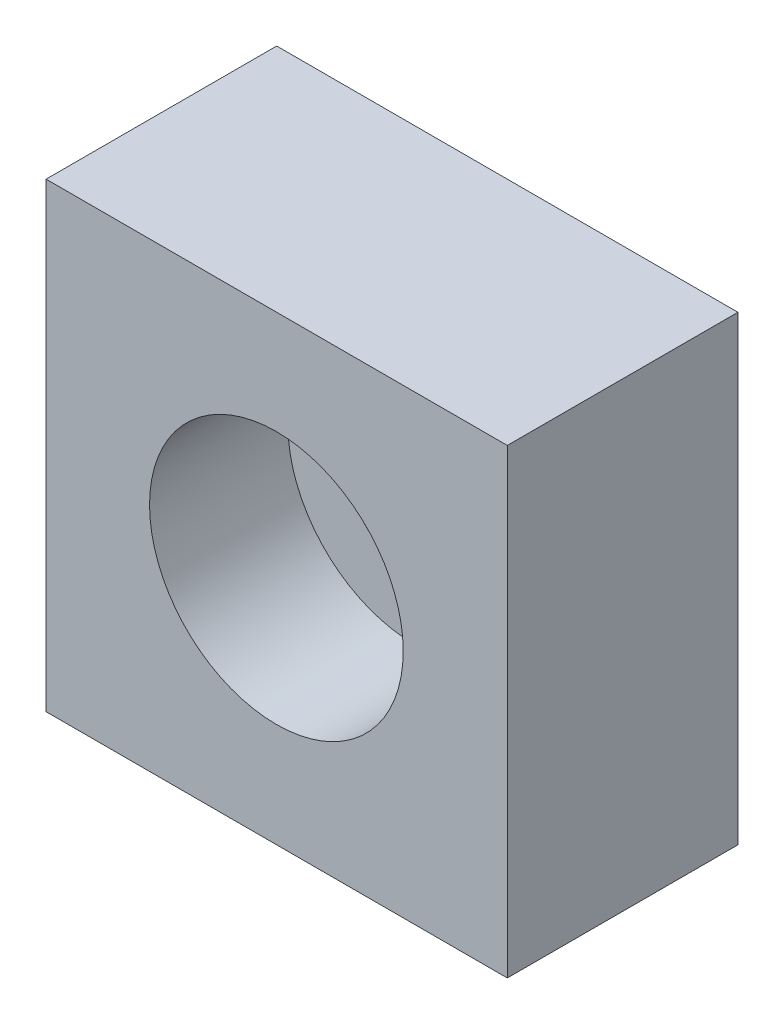
ISO-10303-21;
HEADER;
FILE_DESCRIPTION(('STEP AP214'),'2;1');
FILE_NAME('part.step','',(''),(''),'','','');
FILE_SCHEMA(('AUTOMOTIVE_DESIGN { 1 0 10303 214 1 1 1 1 }'));
ENDSEC;
DATA;
#1=APPLICATION_CONTEXT('core data for automotive mechanical design processes');
#2=APPLICATION_PROTOCOL_DEFINITION('international standard','automotive_design',2000,#1);
#3=PRODUCT_CONTEXT('',#1,'mechanical');
#4=PRODUCT('Part','Part','',(#3));
#5=PRODUCT_RELATED_PRODUCT_CATEGORY('part','',(#4));
#6=PRODUCT_DEFINITION_FORMATION('','',#4);
#7=PRODUCT_DEFINITION_CONTEXT('part definition',#1,'design');
#8=PRODUCT_DEFINITION('design','',#6,#7);
#9=PRODUCT_DEFINITION_SHAPE('','',#8);
#10=(LENGTH_UNIT() NAMED_UNIT(*) SI_UNIT(.MILLI.,.METRE.));
#11=(NAMED_UNIT(*) PLANE_ANGLE_UNIT() SI_UNIT($,.RADIAN.));
#12=(NAMED_UNIT(*) SI_UNIT($,.STERADIAN.) SOLID_ANGLE_UNIT());
#13=UNCERTAINTY_MEASURE_WITH_UNIT(LENGTH_MEASURE(1.E-05),#10,'distance_accuracy_value','');
#14=(GEOMETRIC_REPRESENTATION_CONTEXT(3) GLOBAL_UNCERTAINTY_ASSIGNED_CONTEXT((#13)) GLOBAL_UNIT_ASSIGNED_CONTEXT((#10,
#11,#12)) REPRESENTATION_CONTEXT('',''));
#15=CARTESIAN_POINT('',(0.,0.,0.));
#16=DIRECTION('',(0.,0.,1.));
#17=DIRECTION('',(1.,0.,0.));
#18=AXIS2_PLACEMENT_3D('',#15,#16,#17);
#19=CARTESIAN_POINT('',(0.,0.,10.));
#20=DIRECTION('',(1.,0.,0.));
#21=DIRECTION('',(0.,0.,-1.));
#22=AXIS2_PLACEMENT_3D('',#19,#20,#21);
#23=PLANE('',#22);
#24=DIRECTION('',(0.,-1.,0.));
#25=VECTOR('',#24,1.);
#26=CARTESIAN_POINT('',(0.,0.,0.));
#27=LINE('',#26,#25);
#28=CARTESIAN_POINT('',(0.,20.,0.));
#29=VERTEX_POINT('',#28);
#30=CARTESIAN_POINT('',(0.,0.,0.));
#31=VERTEX_POINT('',#30);
#32=EDGE_CURVE('E105',#29,#31,#27,.T.);
#33=ORIENTED_EDGE('',*,*,#32,.T.);
#34=DIRECTION('',(0.,0.,-1.));
#35=VECTOR('',#34,1.);
#36=CARTESIAN_POINT('',(0.,0.,10.));
#37=LINE('',#36,#35);
#38=CARTESIAN_POINT('',(0.,0.,10.));
#39=VERTEX_POINT('',#38);
#40=EDGE_CURVE('E11',#39,#31,#37,.T.);
#41=ORIENTED_EDGE('',*,*,#40,.F.);
#42=DIRECTION('',(0.,-1.,0.));
#43=VECTOR('',#42,1.);
#44=CARTESIAN_POINT('',(0.,0.,10.));
#45=LINE('',#44,#43);
#46=CARTESIAN_POINT('',(0.,20.,10.));
#47=VERTEX_POINT('',#46);
#48=EDGE_CURVE('E89',#47,#39,#45,.T.);
#49=ORIENTED_EDGE('',*,*,#48,.F.);
#50=DIRECTION('',(0.,0.,-1.));
#51=VECTOR('',#50,1.);
#52=CARTESIAN_POINT('',(0.,20.,10.));
#53=LINE('',#52,#51);
#54=EDGE_CURVE('E98',#47,#29,#53,.T.);
#55=ORIENTED_EDGE('',*,*,#54,.T.);
#56=EDGE_LOOP('',(#33,#41,#49,#55));
#57=FACE_BOUND('',#56,.T.);
#58=ADVANCED_FACE('F39',(#57),#23,.F.);
#59=CARTESIAN_POINT('',(0.,0.,10.));
#60=DIRECTION('',(0.,1.,0.));
#61=DIRECTION('',(0.,0.,1.));
#62=AXIS2_PLACEMENT_3D('',#59,#60,#61);
#63=PLANE('',#62);
#64=DIRECTION('',(1.,0.,0.));
#65=VECTOR('',#64,1.);
#66=CARTESIAN_POINT('',(0.,0.,0.));
#67=LINE('',#66,#65);
#68=CARTESIAN_POINT('',(20.,0.,0.));
#69=VERTEX_POINT('',#68);
#70=EDGE_CURVE('E94',#31,#69,#67,.T.);
#71=ORIENTED_EDGE('',*,*,#70,.T.);
#72=DIRECTION('',(0.,0.,-1.));
#73=VECTOR('',#72,1.);
#74=CARTESIAN_POINT('',(20.,0.,10.));
#75=LINE('',#74,#73);
#76=CARTESIAN_POINT('',(20.,0.,10.));
#77=VERTEX_POINT('',#76);
#78=EDGE_CURVE('E50',#77,#69,#75,.T.);
#79=ORIENTED_EDGE('',*,*,#78,.F.);
#80=DIRECTION('',(1.,0.,0.));
#81=VECTOR('',#80,1.);
#82=CARTESIAN_POINT('',(0.,0.,10.));
#83=LINE('',#82,#81);
#84=EDGE_CURVE('E85',#39,#77,#83,.T.);
#85=ORIENTED_EDGE('',*,*,#84,.F.);
#86=ORIENTED_EDGE('',*,*,#40,.T.);
#87=EDGE_LOOP('',(#71,#79,#85,#86));
#88=FACE_BOUND('',#87,.T.);
#89=ADVANCED_FACE('F91',(#88),#63,.F.);
#90=CARTESIAN_POINT('',(20.,0.,10.));
#91=DIRECTION('',(-1.,0.,0.));
#92=DIRECTION('',(0.,0.,1.));
#93=AXIS2_PLACEMENT_3D('',#90,#91,#92);
#94=PLANE('',#93);
#95=DIRECTION('',(0.,1.,0.));
#96=VECTOR('',#95,1.);
#97=CARTESIAN_POINT('',(20.,0.,0.));
#98=LINE('',#97,#96);
#99=CARTESIAN_POINT('',(20.,20.,0.));
#100=VERTEX_POINT('',#99);
#101=EDGE_CURVE('E75',#69,#100,#98,.T.);
#102=ORIENTED_EDGE('',*,*,#101,.T.);
#103=DIRECTION('',(0.,0.,-1.));
#104=VECTOR('',#103,1.);
#105=CARTESIAN_POINT('',(20.,20.,10.));
#106=LINE('',#105,#104);
#107=CARTESIAN_POINT('',(20.,20.,10.));
#108=VERTEX_POINT('',#107);
#109=EDGE_CURVE('E92',#108,#100,#106,.T.);
#110=ORIENTED_EDGE('',*,*,#109,.F.);
#111=DIRECTION('',(0.,1.,0.));
#112=VECTOR('',#111,1.);
#113=CARTESIAN_POINT('',(20.,0.,10.));
#114=LINE('',#113,#112);
#115=EDGE_CURVE('E86',#77,#108,#114,.T.);
#116=ORIENTED_EDGE('',*,*,#115,.F.);
#117=ORIENTED_EDGE('',*,*,#78,.T.);
#118=EDGE_LOOP('',(#102,#110,#116,#117));
#119=FACE_BOUND('',#118,.T.);
#120=ADVANCED_FACE('F96',(#119),#94,.F.);
#121=CARTESIAN_POINT('',(0.,20.,10.));
#122=DIRECTION('',(0.,-1.,0.));
#123=DIRECTION('',(0.,0.,-1.));
#124=AXIS2_PLACEMENT_3D('',#121,#122,#123);
#125=PLANE('',#124);
#126=DIRECTION('',(-1.,0.,0.));
#127=VECTOR('',#126,1.);
#128=CARTESIAN_POINT('',(0.,20.,0.));
#129=LINE('',#128,#127);
#130=EDGE_CURVE('E77',#100,#29,#129,.T.);
#131=ORIENTED_EDGE('',*,*,#130,.T.);
#132=ORIENTED_EDGE('',*,*,#54,.F.);
#133=DIRECTION('',(-1.,0.,0.));
#134=VECTOR('',#133,1.);
#135=CARTESIAN_POINT('',(0.,20.,10.));
#136=LINE('',#135,#134);
#137=EDGE_CURVE('E54',#108,#47,#136,.T.);
#138=ORIENTED_EDGE('',*,*,#137,.F.);
#139=ORIENTED_EDGE('',*,*,#109,.T.);
#140=EDGE_LOOP('',(#131,#132,#138,#139));
#141=FACE_BOUND('',#140,.T.);
#142=ADVANCED_FACE('F109',(#141),#125,.F.);
#143=CARTESIAN_POINT('',(0.,0.,10.));
#144=DIRECTION('',(0.,0.,-1.));
#145=DIRECTION('',(-1.,0.,0.));
#146=AXIS2_PLACEMENT_3D('',#143,#144,#145);
#147=PLANE('',#146);
#148=CARTESIAN_POINT('',(9.98648737498797,10.0143055988724,10.));
#149=DIRECTION('',(0.,0.,1.));
#150=DIRECTION('',(1.,0.,0.));
#151=AXIS2_PLACEMENT_3D('',#148,#149,#150);
#152=CIRCLE('',#151,5.49999999999999);
#153=CARTESIAN_POINT('',(15.486487374988,10.0143055988724,10.));
#154=VERTEX_POINT('',#153);
#155=EDGE_CURVE('E123',#154,#154,#152,.T.);
#156=ORIENTED_EDGE('',*,*,#155,.F.);
#157=EDGE_LOOP('',(#156));
#158=FACE_BOUND('',#157,.T.);
#159=ORIENTED_EDGE('',*,*,#48,.T.);
#160=ORIENTED_EDGE('',*,*,#84,.T.);
#161=ORIENTED_EDGE('',*,*,#115,.T.);
#162=ORIENTED_EDGE('',*,*,#137,.T.);
#163=EDGE_LOOP('',(#159,#160,#161,#162));
#164=FACE_BOUND('',#163,.T.);
#165=ADVANCED_FACE('F88',(#158,#164),#147,.F.);
#166=CARTESIAN_POINT('',(0.,0.,0.));
#167=DIRECTION('',(0.,0.,-1.));
#168=DIRECTION('',(-1.,0.,0.));
#169=AXIS2_PLACEMENT_3D('',#166,#167,#168);
#170=PLANE('',#169);
#171=CARTESIAN_POINT('',(9.98648737498797,10.0143055988724,0.));
#172=DIRECTION('',(0.,0.,1.));
#173=DIRECTION('',(1.,0.,0.));
#174=AXIS2_PLACEMENT_3D('',#171,#172,#173);
#175=CIRCLE('',#174,3.00000000000001);
#176=CARTESIAN_POINT('',(12.986487374988,10.0143055988724,0.));
#177=VERTEX_POINT('',#176);
#178=EDGE_CURVE('E104',#177,#177,#175,.T.);
#179=ORIENTED_EDGE('',*,*,#178,.T.);
#180=EDGE_LOOP('',(#179));
#181=FACE_BOUND('',#180,.T.);
#182=ORIENTED_EDGE('',*,*,#32,.F.);
#183=ORIENTED_EDGE('',*,*,#130,.F.);
#184=ORIENTED_EDGE('',*,*,#101,.F.);
#185=ORIENTED_EDGE('',*,*,#70,.F.);
#186=EDGE_LOOP('',(#182,#183,#184,#185));
#187=FACE_BOUND('',#186,.T.);
#188=ADVANCED_FACE('F114',(#181,#187),#170,.T.);
#189=CARTESIAN_POINT('',(9.98648737498797,10.0143055988724,10.));
#190=DIRECTION('',(0.,0.,1.));
#191=DIRECTION('',(1.,0.,0.));
#192=AXIS2_PLACEMENT_3D('',#189,#190,#191);
#193=CYLINDRICAL_SURFACE('',#192,3.00000000000001);
#194=ORIENTED_EDGE('',*,*,#178,.F.);
#195=EDGE_LOOP('',(#194));
#196=FACE_BOUND('',#195,.T.);
#197=CARTESIAN_POINT('',(9.98648737498797,10.0143055988724,4.));
#198=DIRECTION('',(0.,0.,1.));
#199=DIRECTION('',(1.,0.,0.));
#200=AXIS2_PLACEMENT_3D('',#197,#198,#199);
#201=CIRCLE('',#200,3.00000000000001);
#202=CARTESIAN_POINT('',(12.986487374988,10.0143055988724,4.));
#203=VERTEX_POINT('',#202);
#204=EDGE_CURVE('E117',#203,#203,#201,.T.);
#205=ORIENTED_EDGE('',*,*,#204,.T.);
#206=EDGE_LOOP('',(#205));
#207=FACE_BOUND('',#206,.T.);
#208=ADVANCED_FACE('F136',(#196,#207),#193,.F.);
#209=CARTESIAN_POINT('',(12.986487374988,10.0143055988724,4.));
#210=DIRECTION('',(0.,0.,-1.));
#211=DIRECTION('',(-1.,0.,0.));
#212=AXIS2_PLACEMENT_3D('',#209,#210,#211);
#213=PLANE('',#212);
#214=ORIENTED_EDGE('',*,*,#204,.F.);
#215=EDGE_LOOP('',(#214));
#216=FACE_BOUND('',#215,.T.);
#217=CARTESIAN_POINT('',(9.98648737498797,10.0143055988724,4.));
#218=DIRECTION('',(0.,0.,1.));
#219=DIRECTION('',(1.,0.,0.));
#220=AXIS2_PLACEMENT_3D('',#217,#218,#219);
#221=CIRCLE('',#220,5.49999999999999);
#222=CARTESIAN_POINT('',(15.486487374988,10.0143055988724,4.));
#223=VERTEX_POINT('',#222);
#224=EDGE_CURVE('E121',#223,#223,#221,.T.);
#225=ORIENTED_EDGE('',*,*,#224,.T.);
#226=EDGE_LOOP('',(#225));
#227=FACE_BOUND('',#226,.T.);
#228=ADVANCED_FACE('F176',(#216,#227),#213,.F.);
#229=CARTESIAN_POINT('',(9.98648737498797,10.0143055988724,10.));
#230=DIRECTION('',(0.,0.,1.));
#231=DIRECTION('',(1.,0.,0.));
#232=AXIS2_PLACEMENT_3D('',#229,#230,#231);
#233=CYLINDRICAL_SURFACE('',#232,5.49999999999999);
#234=ORIENTED_EDGE('',*,*,#224,.F.);
#235=EDGE_LOOP('',(#234));
#236=FACE_BOUND('',#235,.T.);
#237=ORIENTED_EDGE('',*,*,#155,.T.);
#238=EDGE_LOOP('',(#237));
#239=FACE_BOUND('',#238,.T.);
#240=ADVANCED_FACE('F126',(#236,#239),#233,.F.);
#241=CLOSED_SHELL('',(#58,#89,#120,#142,#165,#188,#208,#228,#240));
#242=MANIFOLD_SOLID_BREP('B2',#241);
#243=ADVANCED_BREP_SHAPE_REPRESENTATION('',(#18,#242),#14);
#244=SHAPE_DEFINITION_REPRESENTATION(#9,#243);
ENDSEC;
END-ISO-10303-21;
